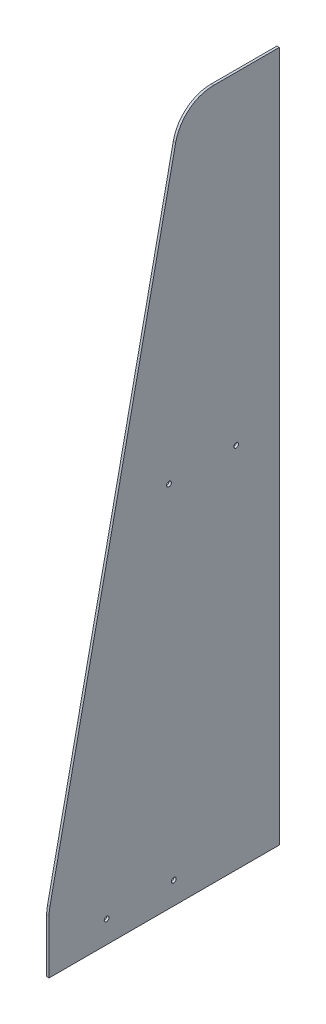
ISO-10303-21;
HEADER;
FILE_DESCRIPTION(('STEP AP214'),'2;1');
FILE_NAME('part.step','',(''),(''),'','','');
FILE_SCHEMA(('AUTOMOTIVE_DESIGN { 1 0 10303 214 1 1 1 1 }'));
ENDSEC;
DATA;
#1=APPLICATION_CONTEXT('core data for automotive mechanical design processes');
#2=APPLICATION_PROTOCOL_DEFINITION('international standard','automotive_design',2000,#1);
#3=PRODUCT_CONTEXT('',#1,'mechanical');
#4=PRODUCT('Part','Part','',(#3));
#5=PRODUCT_RELATED_PRODUCT_CATEGORY('part','',(#4));
#6=PRODUCT_DEFINITION_FORMATION('','',#4);
#7=PRODUCT_DEFINITION_CONTEXT('part definition',#1,'design');
#8=PRODUCT_DEFINITION('design','',#6,#7);
#9=PRODUCT_DEFINITION_SHAPE('','',#8);
#10=(LENGTH_UNIT() NAMED_UNIT(*) SI_UNIT(.MILLI.,.METRE.));
#11=(NAMED_UNIT(*) PLANE_ANGLE_UNIT() SI_UNIT($,.RADIAN.));
#12=(NAMED_UNIT(*) SI_UNIT($,.STERADIAN.) SOLID_ANGLE_UNIT());
#13=UNCERTAINTY_MEASURE_WITH_UNIT(LENGTH_MEASURE(1.E-05),#10,'distance_accuracy_value','');
#14=(GEOMETRIC_REPRESENTATION_CONTEXT(3) GLOBAL_UNCERTAINTY_ASSIGNED_CONTEXT((#13)) GLOBAL_UNIT_ASSIGNED_CONTEXT((#10,
#11,#12)) REPRESENTATION_CONTEXT('',''));
#15=CARTESIAN_POINT('',(0.,0.,0.));
#16=DIRECTION('',(0.,0.,1.));
#17=DIRECTION('',(1.,0.,0.));
#18=AXIS2_PLACEMENT_3D('',#15,#16,#17);
#19=CARTESIAN_POINT('',(3.175,863.6,100.150182784968));
#20=DIRECTION('',(-1.,0.,0.));
#21=DIRECTION('',(0.,0.,1.));
#22=AXIS2_PLACEMENT_3D('',#19,#20,#21);
#23=CYLINDRICAL_SURFACE('',#22,50.8);
#24=CARTESIAN_POINT('',(0.,863.6,100.150182784968));
#25=DIRECTION('',(1.,0.,0.));
#26=DIRECTION('',(0.,0.,-1.));
#27=AXIS2_PLACEMENT_3D('',#24,#25,#26);
#28=CIRCLE('',#27,50.8);
#29=CARTESIAN_POINT('',(0.,874.045513000825,149.864680249487));
#30=VERTEX_POINT('',#29);
#31=CARTESIAN_POINT('',(0.,914.4,100.150182784968));
#32=VERTEX_POINT('',#31);
#33=EDGE_CURVE('E162',#30,#32,#28,.F.);
#34=ORIENTED_EDGE('',*,*,#33,.F.);
#35=DIRECTION('',(-1.,0.,0.));
#36=VECTOR('',#35,1.);
#37=CARTESIAN_POINT('',(3.175,874.045513000825,149.864680249487));
#38=LINE('',#37,#36);
#39=CARTESIAN_POINT('',(3.175,874.045513000825,149.864680249487));
#40=VERTEX_POINT('',#39);
#41=EDGE_CURVE('E11',#40,#30,#38,.T.);
#42=ORIENTED_EDGE('',*,*,#41,.F.);
#43=CARTESIAN_POINT('',(3.175,863.6,100.150182784968));
#44=DIRECTION('',(1.,0.,0.));
#45=DIRECTION('',(0.,0.,-1.));
#46=AXIS2_PLACEMENT_3D('',#43,#44,#45);
#47=CIRCLE('',#46,50.8);
#48=CARTESIAN_POINT('',(3.175,914.4,100.150182784968));
#49=VERTEX_POINT('',#48);
#50=EDGE_CURVE('E372',#40,#49,#47,.F.);
#51=ORIENTED_EDGE('',*,*,#50,.T.);
#52=DIRECTION('',(-1.,0.,0.));
#53=VECTOR('',#52,1.);
#54=CARTESIAN_POINT('',(3.175,914.4,100.150182784968));
#55=LINE('',#54,#53);
#56=EDGE_CURVE('E72',#49,#32,#55,.T.);
#57=ORIENTED_EDGE('',*,*,#56,.T.);
#58=EDGE_LOOP('',(#34,#42,#51,#57));
#59=FACE_BOUND('',#58,.T.);
#60=ADVANCED_FACE('F47',(#59),#23,.T.);
#61=CARTESIAN_POINT('',(3.175,67.1111623571902,319.409655665897));
#62=DIRECTION('',(0.,-0.205620334661924,-0.978631839852719));
#63=DIRECTION('',(0.,0.97863183985272,-0.205620334661924));
#64=AXIS2_PLACEMENT_3D('',#61,#62,#63);
#65=PLANE('',#64);
#66=DIRECTION('',(0.,-0.97863183985272,0.205620334661924));
#67=VECTOR('',#66,1.);
#68=CARTESIAN_POINT('',(0.,67.1111623571902,319.409655665897));
#69=LINE('',#68,#67);
#70=CARTESIAN_POINT('',(0.,81.3663535379903,316.414497464518));
#71=VERTEX_POINT('',#70);
#72=EDGE_CURVE('E165',#30,#71,#69,.T.);
#73=ORIENTED_EDGE('',*,*,#72,.T.);
#74=DIRECTION('',(-1.,0.,0.));
#75=VECTOR('',#74,1.);
#76=CARTESIAN_POINT('',(3.175,81.3663535379903,316.414497464518));
#77=LINE('',#76,#75);
#78=CARTESIAN_POINT('',(3.175,81.3663535379903,316.414497464518));
#79=VERTEX_POINT('',#78);
#80=EDGE_CURVE('E56',#79,#71,#77,.T.);
#81=ORIENTED_EDGE('',*,*,#80,.F.);
#82=DIRECTION('',(0.,-0.97863183985272,0.205620334661924));
#83=VECTOR('',#82,1.);
#84=CARTESIAN_POINT('',(3.175,67.1111623571902,319.409655665897));
#85=LINE('',#84,#83);
#86=EDGE_CURVE('E128',#40,#79,#85,.T.);
#87=ORIENTED_EDGE('',*,*,#86,.F.);
#88=ORIENTED_EDGE('',*,*,#41,.T.);
#89=EDGE_LOOP('',(#73,#81,#87,#88));
#90=FACE_BOUND('',#89,.T.);
#91=ADVANCED_FACE('F192',(#90),#65,.F.);
#92=CARTESIAN_POINT('',(3.175,70.9208405371646,266.7));
#93=DIRECTION('',(-1.,0.,0.));
#94=DIRECTION('',(0.,0.,1.));
#95=AXIS2_PLACEMENT_3D('',#92,#93,#94);
#96=CYLINDRICAL_SURFACE('',#95,50.8);
#97=CARTESIAN_POINT('',(0.,70.9208405371646,266.7));
#98=DIRECTION('',(1.,0.,0.));
#99=DIRECTION('',(0.,0.,-1.));
#100=AXIS2_PLACEMENT_3D('',#97,#98,#99);
#101=CIRCLE('',#100,50.8);
#102=CARTESIAN_POINT('',(0.,70.9208405371646,317.5));
#103=VERTEX_POINT('',#102);
#104=EDGE_CURVE('E112',#103,#71,#101,.F.);
#105=ORIENTED_EDGE('',*,*,#104,.F.);
#106=DIRECTION('',(-1.,0.,0.));
#107=VECTOR('',#106,1.);
#108=CARTESIAN_POINT('',(3.175,70.9208405371646,317.5));
#109=LINE('',#108,#107);
#110=CARTESIAN_POINT('',(3.175,70.9208405371646,317.5));
#111=VERTEX_POINT('',#110);
#112=EDGE_CURVE('E107',#111,#103,#109,.T.);
#113=ORIENTED_EDGE('',*,*,#112,.F.);
#114=CARTESIAN_POINT('',(3.175,70.9208405371646,266.7));
#115=DIRECTION('',(1.,0.,0.));
#116=DIRECTION('',(0.,0.,-1.));
#117=AXIS2_PLACEMENT_3D('',#114,#115,#116);
#118=CIRCLE('',#117,50.8);
#119=EDGE_CURVE('E110',#111,#79,#118,.F.);
#120=ORIENTED_EDGE('',*,*,#119,.T.);
#121=ORIENTED_EDGE('',*,*,#80,.T.);
#122=EDGE_LOOP('',(#105,#113,#120,#121));
#123=FACE_BOUND('',#122,.T.);
#124=ADVANCED_FACE('F109',(#123),#96,.T.);
#125=CARTESIAN_POINT('',(3.175,0.,317.5));
#126=DIRECTION('',(0.,0.,1.));
#127=DIRECTION('',(1.,0.,0.));
#128=AXIS2_PLACEMENT_3D('',#125,#126,#127);
#129=PLANE('',#128);
#130=DIRECTION('',(0.,1.,0.));
#131=VECTOR('',#130,1.);
#132=CARTESIAN_POINT('',(0.,0.,317.5));
#133=LINE('',#132,#131);
#134=CARTESIAN_POINT('',(0.,0.,317.5));
#135=VERTEX_POINT('',#134);
#136=EDGE_CURVE('E171',#135,#103,#133,.T.);
#137=ORIENTED_EDGE('',*,*,#136,.F.);
#138=DIRECTION('',(-1.,0.,0.));
#139=VECTOR('',#138,1.);
#140=CARTESIAN_POINT('',(3.175,0.,317.5));
#141=LINE('',#140,#139);
#142=CARTESIAN_POINT('',(3.175,0.,317.5));
#143=VERTEX_POINT('',#142);
#144=EDGE_CURVE('E118',#143,#135,#141,.T.);
#145=ORIENTED_EDGE('',*,*,#144,.F.);
#146=DIRECTION('',(0.,1.,0.));
#147=VECTOR('',#146,1.);
#148=CARTESIAN_POINT('',(3.175,0.,317.5));
#149=LINE('',#148,#147);
#150=EDGE_CURVE('E126',#143,#111,#149,.T.);
#151=ORIENTED_EDGE('',*,*,#150,.T.);
#152=ORIENTED_EDGE('',*,*,#112,.T.);
#153=EDGE_LOOP('',(#137,#145,#151,#152));
#154=FACE_BOUND('',#153,.T.);
#155=ADVANCED_FACE('F133',(#154),#129,.T.);
#156=CARTESIAN_POINT('',(3.175,0.,0.));
#157=DIRECTION('',(0.,-1.,0.));
#158=DIRECTION('',(0.,0.,-1.));
#159=AXIS2_PLACEMENT_3D('',#156,#157,#158);
#160=PLANE('',#159);
#161=DIRECTION('',(-1.,0.,0.));
#162=VECTOR('',#161,1.);
#163=CARTESIAN_POINT('',(42.418,-1.11799953179974E-13,12.7));
#164=LINE('',#163,#162);
#165=CARTESIAN_POINT('',(3.175,-1.11799953179974E-13,12.7));
#166=VERTEX_POINT('',#165);
#167=CARTESIAN_POINT('',(0.,0.,12.7));
#168=VERTEX_POINT('',#167);
#169=EDGE_CURVE('E63',#166,#168,#164,.T.);
#170=ORIENTED_EDGE('',*,*,#169,.F.);
#171=DIRECTION('',(0.,0.,1.));
#172=VECTOR('',#171,1.);
#173=CARTESIAN_POINT('',(3.175,0.,0.));
#174=LINE('',#173,#172);
#175=EDGE_CURVE('E136',#166,#143,#174,.T.);
#176=ORIENTED_EDGE('',*,*,#175,.T.);
#177=ORIENTED_EDGE('',*,*,#144,.T.);
#178=DIRECTION('',(0.,0.,1.));
#179=VECTOR('',#178,1.);
#180=CARTESIAN_POINT('',(0.,0.,0.));
#181=LINE('',#180,#179);
#182=EDGE_CURVE('E174',#168,#135,#181,.T.);
#183=ORIENTED_EDGE('',*,*,#182,.F.);
#184=EDGE_LOOP('',(#170,#176,#177,#183));
#185=FACE_BOUND('',#184,.T.);
#186=ADVANCED_FACE('F199',(#185),#160,.T.);
#187=CARTESIAN_POINT('',(3.175,914.4,0.));
#188=DIRECTION('',(0.,1.,0.));
#189=DIRECTION('',(0.,0.,1.));
#190=AXIS2_PLACEMENT_3D('',#187,#188,#189);
#191=PLANE('',#190);
#192=DIRECTION('',(-1.,0.,0.));
#193=VECTOR('',#192,1.);
#194=CARTESIAN_POINT('',(42.418,914.4,12.7));
#195=LINE('',#194,#193);
#196=CARTESIAN_POINT('',(3.175,914.4,12.7));
#197=VERTEX_POINT('',#196);
#198=CARTESIAN_POINT('',(0.,914.4,12.7));
#199=VERTEX_POINT('',#198);
#200=EDGE_CURVE('E207',#197,#199,#195,.T.);
#201=ORIENTED_EDGE('',*,*,#200,.T.);
#202=DIRECTION('',(0.,0.,-1.));
#203=VECTOR('',#202,1.);
#204=CARTESIAN_POINT('',(0.,914.4,0.));
#205=LINE('',#204,#203);
#206=EDGE_CURVE('E177',#32,#199,#205,.T.);
#207=ORIENTED_EDGE('',*,*,#206,.F.);
#208=ORIENTED_EDGE('',*,*,#56,.F.);
#209=DIRECTION('',(0.,0.,-1.));
#210=VECTOR('',#209,1.);
#211=CARTESIAN_POINT('',(3.175,914.4,0.));
#212=LINE('',#211,#210);
#213=EDGE_CURVE('E139',#49,#197,#212,.T.);
#214=ORIENTED_EDGE('',*,*,#213,.T.);
#215=EDGE_LOOP('',(#201,#207,#208,#214));
#216=FACE_BOUND('',#215,.T.);
#217=ADVANCED_FACE('F210',(#216),#191,.T.);
#218=CARTESIAN_POINT('',(3.175,486.804131036418,158.75));
#219=DIRECTION('',(-1.,0.,0.));
#220=DIRECTION('',(0.,0.,1.));
#221=AXIS2_PLACEMENT_3D('',#218,#219,#220);
#222=CYLINDRICAL_SURFACE('',#221,3.17499999999997);
#223=CARTESIAN_POINT('',(3.175,486.804131036418,158.75));
#224=DIRECTION('',(1.,0.,0.));
#225=DIRECTION('',(0.,0.,-1.));
#226=AXIS2_PLACEMENT_3D('',#223,#224,#225);
#227=CIRCLE('',#226,3.17499999999997);
#228=CARTESIAN_POINT('',(3.175,486.804131036418,155.575));
#229=VERTEX_POINT('',#228);
#230=EDGE_CURVE('E367',#229,#229,#227,.T.);
#231=ORIENTED_EDGE('',*,*,#230,.T.);
#232=EDGE_LOOP('',(#231));
#233=FACE_BOUND('',#232,.T.);
#234=CARTESIAN_POINT('',(0.,486.804131036418,158.75));
#235=DIRECTION('',(1.,0.,0.));
#236=DIRECTION('',(0.,0.,-1.));
#237=AXIS2_PLACEMENT_3D('',#234,#235,#236);
#238=CIRCLE('',#237,3.17499999999997);
#239=CARTESIAN_POINT('',(0.,486.804131036418,155.575));
#240=VERTEX_POINT('',#239);
#241=EDGE_CURVE('E158',#240,#240,#238,.T.);
#242=ORIENTED_EDGE('',*,*,#241,.F.);
#243=EDGE_LOOP('',(#242));
#244=FACE_BOUND('',#243,.T.);
#245=ADVANCED_FACE('F221',(#233,#244),#222,.F.);
#246=CARTESIAN_POINT('',(3.175,29.604131036418,152.4));
#247=DIRECTION('',(-1.,0.,0.));
#248=DIRECTION('',(0.,0.,1.));
#249=AXIS2_PLACEMENT_3D('',#246,#247,#248);
#250=CYLINDRICAL_SURFACE('',#249,3.175);
#251=CARTESIAN_POINT('',(3.175,29.604131036418,152.4));
#252=DIRECTION('',(1.,0.,0.));
#253=DIRECTION('',(0.,0.,-1.));
#254=AXIS2_PLACEMENT_3D('',#251,#252,#253);
#255=CIRCLE('',#254,3.175);
#256=CARTESIAN_POINT('',(3.175,29.604131036418,149.225));
#257=VERTEX_POINT('',#256);
#258=EDGE_CURVE('E235',#257,#257,#255,.T.);
#259=ORIENTED_EDGE('',*,*,#258,.T.);
#260=EDGE_LOOP('',(#259));
#261=FACE_BOUND('',#260,.T.);
#262=CARTESIAN_POINT('',(0.,29.604131036418,152.4));
#263=DIRECTION('',(1.,0.,0.));
#264=DIRECTION('',(0.,0.,-1.));
#265=AXIS2_PLACEMENT_3D('',#262,#263,#264);
#266=CIRCLE('',#265,3.175);
#267=CARTESIAN_POINT('',(0.,29.604131036418,149.225));
#268=VERTEX_POINT('',#267);
#269=EDGE_CURVE('E153',#268,#268,#266,.T.);
#270=ORIENTED_EDGE('',*,*,#269,.F.);
#271=EDGE_LOOP('',(#270));
#272=FACE_BOUND('',#271,.T.);
#273=ADVANCED_FACE('F223',(#261,#272),#250,.F.);
#274=CARTESIAN_POINT('',(3.175,486.804131036418,69.85));
#275=DIRECTION('',(-1.,0.,0.));
#276=DIRECTION('',(0.,0.,1.));
#277=AXIS2_PLACEMENT_3D('',#274,#275,#276);
#278=CYLINDRICAL_SURFACE('',#277,3.175);
#279=CARTESIAN_POINT('',(3.175,486.804131036418,69.85));
#280=DIRECTION('',(1.,0.,0.));
#281=DIRECTION('',(0.,0.,-1.));
#282=AXIS2_PLACEMENT_3D('',#279,#280,#281);
#283=CIRCLE('',#282,3.175);
#284=CARTESIAN_POINT('',(3.175,486.804131036418,66.675));
#285=VERTEX_POINT('',#284);
#286=EDGE_CURVE('E185',#285,#285,#283,.T.);
#287=ORIENTED_EDGE('',*,*,#286,.T.);
#288=EDGE_LOOP('',(#287));
#289=FACE_BOUND('',#288,.T.);
#290=CARTESIAN_POINT('',(0.,486.804131036418,69.85));
#291=DIRECTION('',(1.,0.,0.));
#292=DIRECTION('',(0.,0.,-1.));
#293=AXIS2_PLACEMENT_3D('',#290,#291,#292);
#294=CIRCLE('',#293,3.175);
#295=CARTESIAN_POINT('',(0.,486.804131036418,66.675));
#296=VERTEX_POINT('',#295);
#297=EDGE_CURVE('E149',#296,#296,#294,.T.);
#298=ORIENTED_EDGE('',*,*,#297,.F.);
#299=EDGE_LOOP('',(#298));
#300=FACE_BOUND('',#299,.T.);
#301=ADVANCED_FACE('F49',(#289,#300),#278,.F.);
#302=CARTESIAN_POINT('',(3.175,29.604131036418,241.3));
#303=DIRECTION('',(-1.,0.,0.));
#304=DIRECTION('',(0.,0.,1.));
#305=AXIS2_PLACEMENT_3D('',#302,#303,#304);
#306=CYLINDRICAL_SURFACE('',#305,3.17499999999997);
#307=CARTESIAN_POINT('',(3.175,29.604131036418,241.3));
#308=DIRECTION('',(1.,0.,0.));
#309=DIRECTION('',(0.,0.,-1.));
#310=AXIS2_PLACEMENT_3D('',#307,#308,#309);
#311=CIRCLE('',#310,3.17499999999997);
#312=CARTESIAN_POINT('',(3.175,29.604131036418,238.125));
#313=VERTEX_POINT('',#312);
#314=EDGE_CURVE('E145',#313,#313,#311,.T.);
#315=ORIENTED_EDGE('',*,*,#314,.T.);
#316=EDGE_LOOP('',(#315));
#317=FACE_BOUND('',#316,.T.);
#318=CARTESIAN_POINT('',(0.,29.604131036418,241.3));
#319=DIRECTION('',(1.,0.,0.));
#320=DIRECTION('',(0.,0.,-1.));
#321=AXIS2_PLACEMENT_3D('',#318,#319,#320);
#322=CIRCLE('',#321,3.17499999999997);
#323=CARTESIAN_POINT('',(0.,29.604131036418,238.125));
#324=VERTEX_POINT('',#323);
#325=EDGE_CURVE('E181',#324,#324,#322,.T.);
#326=ORIENTED_EDGE('',*,*,#325,.F.);
#327=EDGE_LOOP('',(#326));
#328=FACE_BOUND('',#327,.T.);
#329=ADVANCED_FACE('F230',(#317,#328),#306,.F.);
#330=CARTESIAN_POINT('',(3.175,0.,0.));
#331=DIRECTION('',(1.,0.,0.));
#332=DIRECTION('',(0.,0.,-1.));
#333=AXIS2_PLACEMENT_3D('',#330,#331,#332);
#334=PLANE('',#333);
#335=DIRECTION('',(0.,-1.,0.));
#336=VECTOR('',#335,1.);
#337=CARTESIAN_POINT('',(3.175,0.,12.7));
#338=LINE('',#337,#336);
#339=EDGE_CURVE('E154',#197,#166,#338,.T.);
#340=ORIENTED_EDGE('',*,*,#339,.F.);
#341=ORIENTED_EDGE('',*,*,#213,.F.);
#342=ORIENTED_EDGE('',*,*,#50,.F.);
#343=ORIENTED_EDGE('',*,*,#86,.T.);
#344=ORIENTED_EDGE('',*,*,#119,.F.);
#345=ORIENTED_EDGE('',*,*,#150,.F.);
#346=ORIENTED_EDGE('',*,*,#175,.F.);
#347=EDGE_LOOP('',(#340,#341,#342,#343,#344,#345,#346));
#348=FACE_BOUND('',#347,.T.);
#349=ORIENTED_EDGE('',*,*,#286,.F.);
#350=EDGE_LOOP('',(#349));
#351=FACE_BOUND('',#350,.T.);
#352=ORIENTED_EDGE('',*,*,#258,.F.);
#353=EDGE_LOOP('',(#352));
#354=FACE_BOUND('',#353,.T.);
#355=ORIENTED_EDGE('',*,*,#230,.F.);
#356=EDGE_LOOP('',(#355));
#357=FACE_BOUND('',#356,.T.);
#358=ORIENTED_EDGE('',*,*,#314,.F.);
#359=EDGE_LOOP('',(#358));
#360=FACE_BOUND('',#359,.T.);
#361=ADVANCED_FACE('F123',(#348,#351,#354,#357,#360),#334,.T.);
#362=CARTESIAN_POINT('',(0.,0.,0.));
#363=DIRECTION('',(1.,0.,0.));
#364=DIRECTION('',(0.,0.,-1.));
#365=AXIS2_PLACEMENT_3D('',#362,#363,#364);
#366=PLANE('',#365);
#367=ORIENTED_EDGE('',*,*,#297,.T.);
#368=EDGE_LOOP('',(#367));
#369=FACE_BOUND('',#368,.T.);
#370=ORIENTED_EDGE('',*,*,#269,.T.);
#371=EDGE_LOOP('',(#370));
#372=FACE_BOUND('',#371,.T.);
#373=ORIENTED_EDGE('',*,*,#241,.T.);
#374=EDGE_LOOP('',(#373));
#375=FACE_BOUND('',#374,.T.);
#376=ORIENTED_EDGE('',*,*,#206,.T.);
#377=DIRECTION('',(0.,1.,0.));
#378=VECTOR('',#377,1.);
#379=CARTESIAN_POINT('',(0.,914.4,12.7));
#380=LINE('',#379,#378);
#381=EDGE_CURVE('E197',#168,#199,#380,.T.);
#382=ORIENTED_EDGE('',*,*,#381,.F.);
#383=ORIENTED_EDGE('',*,*,#182,.T.);
#384=ORIENTED_EDGE('',*,*,#136,.T.);
#385=ORIENTED_EDGE('',*,*,#104,.T.);
#386=ORIENTED_EDGE('',*,*,#72,.F.);
#387=ORIENTED_EDGE('',*,*,#33,.T.);
#388=EDGE_LOOP('',(#376,#382,#383,#384,#385,#386,#387));
#389=FACE_BOUND('',#388,.T.);
#390=ORIENTED_EDGE('',*,*,#325,.T.);
#391=EDGE_LOOP('',(#390));
#392=FACE_BOUND('',#391,.T.);
#393=ADVANCED_FACE('F194',(#369,#372,#375,#389,#392),#366,.F.);
#394=CARTESIAN_POINT('',(42.418,914.4,12.7));
#395=DIRECTION('',(0.,0.,1.));
#396=DIRECTION('',(0.,-1.,0.));
#397=AXIS2_PLACEMENT_3D('',#394,#395,#396);
#398=PLANE('',#397);
#399=ORIENTED_EDGE('',*,*,#339,.T.);
#400=ORIENTED_EDGE('',*,*,#169,.T.);
#401=ORIENTED_EDGE('',*,*,#381,.T.);
#402=ORIENTED_EDGE('',*,*,#200,.F.);
#403=EDGE_LOOP('',(#399,#400,#401,#402));
#404=FACE_BOUND('',#403,.T.);
#405=ADVANCED_FACE('F206',(#404),#398,.F.);
#406=CLOSED_SHELL('',(#60,#91,#124,#155,#186,#217,#245,#273,#301,#329,#361,#393,#405));
#407=MANIFOLD_SOLID_BREP('B2',#406);
#408=ADVANCED_BREP_SHAPE_REPRESENTATION('',(#18,#407),#14);
#409=SHAPE_DEFINITION_REPRESENTATION(#9,#408);
ENDSEC;
END-ISO-10303-21;
